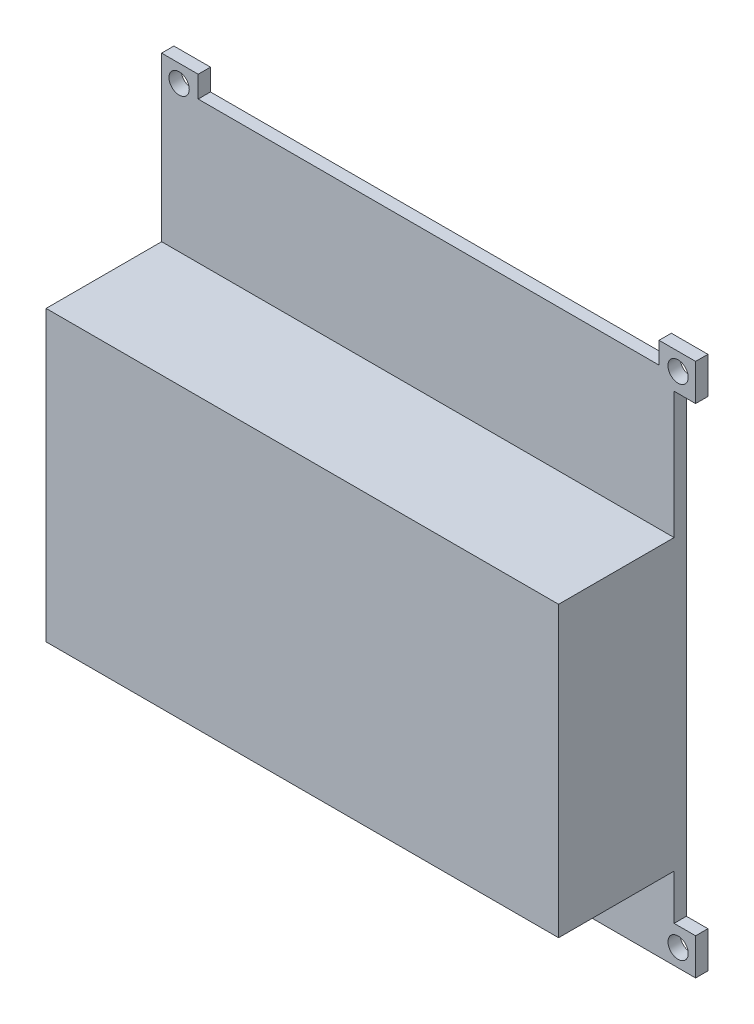
ISO-10303-21;
HEADER;
FILE_DESCRIPTION(('STEP AP214'),'2;1');
FILE_NAME('part.step','',(''),(''),'','','');
FILE_SCHEMA(('AUTOMOTIVE_DESIGN { 1 0 10303 214 1 1 1 1 }'));
ENDSEC;
DATA;
#1=APPLICATION_CONTEXT('core data for automotive mechanical design processes');
#2=APPLICATION_PROTOCOL_DEFINITION('international standard','automotive_design',2000,#1);
#3=PRODUCT_CONTEXT('',#1,'mechanical');
#4=PRODUCT('Part','Part','',(#3));
#5=PRODUCT_RELATED_PRODUCT_CATEGORY('part','',(#4));
#6=PRODUCT_DEFINITION_FORMATION('','',#4);
#7=PRODUCT_DEFINITION_CONTEXT('part definition',#1,'design');
#8=PRODUCT_DEFINITION('design','',#6,#7);
#9=PRODUCT_DEFINITION_SHAPE('','',#8);
#10=(LENGTH_UNIT() NAMED_UNIT(*) SI_UNIT(.MILLI.,.METRE.));
#11=(NAMED_UNIT(*) PLANE_ANGLE_UNIT() SI_UNIT($,.RADIAN.));
#12=(NAMED_UNIT(*) SI_UNIT($,.STERADIAN.) SOLID_ANGLE_UNIT());
#13=UNCERTAINTY_MEASURE_WITH_UNIT(LENGTH_MEASURE(1.E-05),#10,'distance_accuracy_value','');
#14=(GEOMETRIC_REPRESENTATION_CONTEXT(3) GLOBAL_UNCERTAINTY_ASSIGNED_CONTEXT((#13)) GLOBAL_UNIT_ASSIGNED_CONTEXT((#10,
#11,#12)) REPRESENTATION_CONTEXT('',''));
#15=CARTESIAN_POINT('',(0.,0.,0.));
#16=DIRECTION('',(0.,0.,1.));
#17=DIRECTION('',(1.,0.,0.));
#18=AXIS2_PLACEMENT_3D('',#15,#16,#17);
#19=CARTESIAN_POINT('',(0.,86.9,2.));
#20=DIRECTION('',(0.,-1.,0.));
#21=DIRECTION('',(0.,0.,-1.));
#22=AXIS2_PLACEMENT_3D('',#19,#20,#21);
#23=PLANE('',#22);
#24=DIRECTION('',(0.,0.,1.));
#25=VECTOR('',#24,1.);
#26=CARTESIAN_POINT('',(-80.95,86.9,0.));
#27=LINE('',#26,#25);
#28=CARTESIAN_POINT('',(-80.95,86.9,0.));
#29=VERTEX_POINT('',#28);
#30=CARTESIAN_POINT('',(-80.95,86.9,2.));
#31=VERTEX_POINT('',#30);
#32=EDGE_CURVE('E270',#29,#31,#27,.T.);
#33=ORIENTED_EDGE('',*,*,#32,.F.);
#34=DIRECTION('',(-1.,0.,0.));
#35=VECTOR('',#34,1.);
#36=CARTESIAN_POINT('',(0.,86.9,0.));
#37=LINE('',#36,#35);
#38=CARTESIAN_POINT('',(-86.9,86.9,0.));
#39=VERTEX_POINT('',#38);
#40=EDGE_CURVE('E216',#29,#39,#37,.T.);
#41=ORIENTED_EDGE('',*,*,#40,.T.);
#42=DIRECTION('',(0.,0.,-1.));
#43=VECTOR('',#42,1.);
#44=CARTESIAN_POINT('',(-86.9,86.9,2.));
#45=LINE('',#44,#43);
#46=CARTESIAN_POINT('',(-86.9,86.9,2.));
#47=VERTEX_POINT('',#46);
#48=EDGE_CURVE('E226',#47,#39,#45,.T.);
#49=ORIENTED_EDGE('',*,*,#48,.F.);
#50=DIRECTION('',(-1.,0.,0.));
#51=VECTOR('',#50,1.);
#52=CARTESIAN_POINT('',(0.,86.9,2.));
#53=LINE('',#52,#51);
#54=EDGE_CURVE('E408',#31,#47,#53,.T.);
#55=ORIENTED_EDGE('',*,*,#54,.F.);
#56=EDGE_LOOP('',(#33,#41,#49,#55));
#57=FACE_BOUND('',#56,.T.);
#58=ADVANCED_FACE('F44',(#57),#23,.F.);
#59=CARTESIAN_POINT('',(0.,0.,20.8));
#60=DIRECTION('',(0.,0.,-1.));
#61=DIRECTION('',(-1.,0.,0.));
#62=AXIS2_PLACEMENT_3D('',#59,#60,#61);
#63=PLANE('',#62);
#64=DIRECTION('',(0.,-1.,0.));
#65=VECTOR('',#64,1.);
#66=CARTESIAN_POINT('',(-3.5,80.95,20.8));
#67=LINE('',#66,#65);
#68=CARTESIAN_POINT('',(-3.5,60.32,20.8));
#69=VERTEX_POINT('',#68);
#70=CARTESIAN_POINT('',(-3.5,13.32,20.8));
#71=VERTEX_POINT('',#70);
#72=EDGE_CURVE('E68',#69,#71,#67,.T.);
#73=ORIENTED_EDGE('',*,*,#72,.F.);
#74=DIRECTION('',(1.,0.,0.));
#75=VECTOR('',#74,1.);
#76=CARTESIAN_POINT('',(-86.9,60.32,20.8));
#77=LINE('',#76,#75);
#78=CARTESIAN_POINT('',(-86.9,60.32,20.8));
#79=VERTEX_POINT('',#78);
#80=EDGE_CURVE('E338',#79,#69,#77,.T.);
#81=ORIENTED_EDGE('',*,*,#80,.F.);
#82=DIRECTION('',(0.,-1.,0.));
#83=VECTOR('',#82,1.);
#84=CARTESIAN_POINT('',(-86.9,60.32,20.8));
#85=LINE('',#84,#83);
#86=CARTESIAN_POINT('',(-86.9,13.32,20.8));
#87=VERTEX_POINT('',#86);
#88=EDGE_CURVE('E348',#79,#87,#85,.T.);
#89=ORIENTED_EDGE('',*,*,#88,.T.);
#90=DIRECTION('',(1.,0.,0.));
#91=VECTOR('',#90,1.);
#92=CARTESIAN_POINT('',(-86.9,13.32,20.8));
#93=LINE('',#92,#91);
#94=EDGE_CURVE('E345',#87,#71,#93,.T.);
#95=ORIENTED_EDGE('',*,*,#94,.T.);
#96=EDGE_LOOP('',(#73,#81,#89,#95));
#97=FACE_BOUND('',#96,.T.);
#98=ADVANCED_FACE('F457',(#97),#63,.F.);
#99=CARTESIAN_POINT('',(0.,0.,2.));
#100=DIRECTION('',(-1.,0.,0.));
#101=DIRECTION('',(0.,0.,1.));
#102=AXIS2_PLACEMENT_3D('',#99,#100,#101);
#103=PLANE('',#102);
#104=DIRECTION('',(0.,0.,1.));
#105=VECTOR('',#104,1.);
#106=CARTESIAN_POINT('',(0.,80.95,0.));
#107=LINE('',#106,#105);
#108=CARTESIAN_POINT('',(0.,80.95,0.));
#109=VERTEX_POINT('',#108);
#110=CARTESIAN_POINT('',(0.,80.95,2.));
#111=VERTEX_POINT('',#110);
#112=EDGE_CURVE('E187',#109,#111,#107,.T.);
#113=ORIENTED_EDGE('',*,*,#112,.F.);
#114=DIRECTION('',(0.,1.,0.));
#115=VECTOR('',#114,1.);
#116=CARTESIAN_POINT('',(0.,0.,0.));
#117=LINE('',#116,#115);
#118=CARTESIAN_POINT('',(0.,86.9,0.));
#119=VERTEX_POINT('',#118);
#120=EDGE_CURVE('E197',#109,#119,#117,.T.);
#121=ORIENTED_EDGE('',*,*,#120,.T.);
#122=DIRECTION('',(0.,0.,-1.));
#123=VECTOR('',#122,1.);
#124=CARTESIAN_POINT('',(0.,86.9,2.));
#125=LINE('',#124,#123);
#126=CARTESIAN_POINT('',(0.,86.9,2.));
#127=VERTEX_POINT('',#126);
#128=EDGE_CURVE('E224',#127,#119,#125,.T.);
#129=ORIENTED_EDGE('',*,*,#128,.F.);
#130=DIRECTION('',(0.,1.,0.));
#131=VECTOR('',#130,1.);
#132=CARTESIAN_POINT('',(0.,0.,2.));
#133=LINE('',#132,#131);
#134=EDGE_CURVE('E205',#111,#127,#133,.T.);
#135=ORIENTED_EDGE('',*,*,#134,.F.);
#136=EDGE_LOOP('',(#113,#121,#129,#135));
#137=FACE_BOUND('',#136,.T.);
#138=ADVANCED_FACE('F200',(#137),#103,.F.);
#139=CARTESIAN_POINT('',(0.,0.,0.));
#140=DIRECTION('',(0.,0.,-1.));
#141=DIRECTION('',(-1.,0.,0.));
#142=AXIS2_PLACEMENT_3D('',#139,#140,#141);
#143=PLANE('',#142);
#144=CARTESIAN_POINT('',(-84.05,84.05,0.));
#145=DIRECTION('',(0.,0.,1.));
#146=DIRECTION('',(1.,0.,0.));
#147=AXIS2_PLACEMENT_3D('',#144,#145,#146);
#148=CIRCLE('',#147,1.65);
#149=CARTESIAN_POINT('',(-82.4,84.05,0.));
#150=VERTEX_POINT('',#149);
#151=EDGE_CURVE('E365',#150,#150,#148,.T.);
#152=ORIENTED_EDGE('',*,*,#151,.T.);
#153=EDGE_LOOP('',(#152));
#154=FACE_BOUND('',#153,.T.);
#155=CARTESIAN_POINT('',(-2.84999999999997,84.05,0.));
#156=DIRECTION('',(0.,0.,1.));
#157=DIRECTION('',(1.,0.,0.));
#158=AXIS2_PLACEMENT_3D('',#155,#156,#157);
#159=CIRCLE('',#158,1.65);
#160=CARTESIAN_POINT('',(-1.19999999999997,84.05,0.));
#161=VERTEX_POINT('',#160);
#162=EDGE_CURVE('E378',#161,#161,#159,.T.);
#163=ORIENTED_EDGE('',*,*,#162,.T.);
#164=EDGE_LOOP('',(#163));
#165=FACE_BOUND('',#164,.T.);
#166=CARTESIAN_POINT('',(-2.85,2.84999999999999,0.));
#167=DIRECTION('',(0.,0.,1.));
#168=DIRECTION('',(1.,0.,0.));
#169=AXIS2_PLACEMENT_3D('',#166,#167,#168);
#170=CIRCLE('',#169,1.65);
#171=CARTESIAN_POINT('',(-1.2,2.84999999999999,0.));
#172=VERTEX_POINT('',#171);
#173=EDGE_CURVE('E371',#172,#172,#170,.T.);
#174=ORIENTED_EDGE('',*,*,#173,.T.);
#175=EDGE_LOOP('',(#174));
#176=FACE_BOUND('',#175,.T.);
#177=CARTESIAN_POINT('',(-84.05,2.85000000000001,0.));
#178=DIRECTION('',(0.,0.,1.));
#179=DIRECTION('',(1.,0.,0.));
#180=AXIS2_PLACEMENT_3D('',#177,#178,#179);
#181=CIRCLE('',#180,1.65);
#182=CARTESIAN_POINT('',(-82.4,2.85000000000001,0.));
#183=VERTEX_POINT('',#182);
#184=EDGE_CURVE('E386',#183,#183,#181,.T.);
#185=ORIENTED_EDGE('',*,*,#184,.T.);
#186=EDGE_LOOP('',(#185));
#187=FACE_BOUND('',#186,.T.);
#188=DIRECTION('',(0.,-1.,0.));
#189=VECTOR('',#188,1.);
#190=CARTESIAN_POINT('',(-3.5,80.95,0.));
#191=LINE('',#190,#189);
#192=CARTESIAN_POINT('',(-3.5,80.95,0.));
#193=VERTEX_POINT('',#192);
#194=CARTESIAN_POINT('',(-3.49999999999999,5.95,0.));
#195=VERTEX_POINT('',#194);
#196=EDGE_CURVE('E195',#193,#195,#191,.T.);
#197=ORIENTED_EDGE('',*,*,#196,.T.);
#198=DIRECTION('',(1.,0.,0.));
#199=VECTOR('',#198,1.);
#200=CARTESIAN_POINT('',(0.,5.95,0.));
#201=LINE('',#200,#199);
#202=CARTESIAN_POINT('',(0.,5.95,0.));
#203=VERTEX_POINT('',#202);
#204=EDGE_CURVE('E202',#195,#203,#201,.T.);
#205=ORIENTED_EDGE('',*,*,#204,.T.);
#206=CARTESIAN_POINT('',(0.,0.,0.));
#207=VERTEX_POINT('',#206);
#208=EDGE_CURVE('E213',#207,#203,#117,.T.);
#209=ORIENTED_EDGE('',*,*,#208,.F.);
#210=DIRECTION('',(-1.,0.,0.));
#211=VECTOR('',#210,1.);
#212=CARTESIAN_POINT('',(0.,0.,0.));
#213=LINE('',#212,#211);
#214=CARTESIAN_POINT('',(-86.9,0.,0.));
#215=VERTEX_POINT('',#214);
#216=EDGE_CURVE('E393',#207,#215,#213,.T.);
#217=ORIENTED_EDGE('',*,*,#216,.T.);
#218=DIRECTION('',(0.,1.,0.));
#219=VECTOR('',#218,1.);
#220=CARTESIAN_POINT('',(-86.9,0.,0.));
#221=LINE('',#220,#219);
#222=EDGE_CURVE('E413',#215,#39,#221,.T.);
#223=ORIENTED_EDGE('',*,*,#222,.T.);
#224=ORIENTED_EDGE('',*,*,#40,.F.);
#225=DIRECTION('',(0.,-1.,0.));
#226=VECTOR('',#225,1.);
#227=CARTESIAN_POINT('',(-80.95,86.9,0.));
#228=LINE('',#227,#226);
#229=CARTESIAN_POINT('',(-80.95,83.4,0.));
#230=VERTEX_POINT('',#229);
#231=EDGE_CURVE('E272',#29,#230,#228,.T.);
#232=ORIENTED_EDGE('',*,*,#231,.T.);
#233=DIRECTION('',(1.,0.,0.));
#234=VECTOR('',#233,1.);
#235=CARTESIAN_POINT('',(-5.95,83.4,0.));
#236=LINE('',#235,#234);
#237=CARTESIAN_POINT('',(-5.95,83.4,0.));
#238=VERTEX_POINT('',#237);
#239=EDGE_CURVE('E268',#230,#238,#236,.T.);
#240=ORIENTED_EDGE('',*,*,#239,.T.);
#241=DIRECTION('',(0.,1.,0.));
#242=VECTOR('',#241,1.);
#243=CARTESIAN_POINT('',(-5.95,86.9,0.));
#244=LINE('',#243,#242);
#245=CARTESIAN_POINT('',(-5.95,86.9,0.));
#246=VERTEX_POINT('',#245);
#247=EDGE_CURVE('E63',#238,#246,#244,.T.);
#248=ORIENTED_EDGE('',*,*,#247,.T.);
#249=EDGE_CURVE('E209',#119,#246,#37,.T.);
#250=ORIENTED_EDGE('',*,*,#249,.F.);
#251=ORIENTED_EDGE('',*,*,#120,.F.);
#252=DIRECTION('',(-1.,0.,0.));
#253=VECTOR('',#252,1.);
#254=CARTESIAN_POINT('',(0.,80.95,0.));
#255=LINE('',#254,#253);
#256=EDGE_CURVE('E182',#109,#193,#255,.T.);
#257=ORIENTED_EDGE('',*,*,#256,.T.);
#258=EDGE_LOOP('',(#197,#205,#209,#217,#223,#224,#232,#240,#248,#250,#251,#257));
#259=FACE_BOUND('',#258,.T.);
#260=ADVANCED_FACE('F210',(#154,#165,#176,#187,#259),#143,.T.);
#261=CARTESIAN_POINT('',(0.,0.,2.));
#262=DIRECTION('',(0.,0.,-1.));
#263=DIRECTION('',(-1.,0.,0.));
#264=AXIS2_PLACEMENT_3D('',#261,#262,#263);
#265=PLANE('',#264);
#266=CARTESIAN_POINT('',(-84.05,2.85000000000001,2.));
#267=DIRECTION('',(0.,0.,1.));
#268=DIRECTION('',(1.,0.,0.));
#269=AXIS2_PLACEMENT_3D('',#266,#267,#268);
#270=CIRCLE('',#269,1.65);
#271=CARTESIAN_POINT('',(-82.4,2.85000000000001,2.));
#272=VERTEX_POINT('',#271);
#273=EDGE_CURVE('E369',#272,#272,#270,.T.);
#274=ORIENTED_EDGE('',*,*,#273,.F.);
#275=EDGE_LOOP('',(#274));
#276=FACE_BOUND('',#275,.T.);
#277=CARTESIAN_POINT('',(-2.85,2.84999999999999,2.));
#278=DIRECTION('',(0.,0.,1.));
#279=DIRECTION('',(1.,0.,0.));
#280=AXIS2_PLACEMENT_3D('',#277,#278,#279);
#281=CIRCLE('',#280,1.65);
#282=CARTESIAN_POINT('',(-1.2,2.84999999999999,2.));
#283=VERTEX_POINT('',#282);
#284=EDGE_CURVE('E366',#283,#283,#281,.T.);
#285=ORIENTED_EDGE('',*,*,#284,.F.);
#286=EDGE_LOOP('',(#285));
#287=FACE_BOUND('',#286,.T.);
#288=CARTESIAN_POINT('',(0.,0.,2.));
#289=VERTEX_POINT('',#288);
#290=CARTESIAN_POINT('',(0.,5.95,2.));
#291=VERTEX_POINT('',#290);
#292=EDGE_CURVE('E232',#289,#291,#133,.T.);
#293=ORIENTED_EDGE('',*,*,#292,.T.);
#294=DIRECTION('',(-1.,0.,0.));
#295=VECTOR('',#294,1.);
#296=CARTESIAN_POINT('',(0.,5.95,2.));
#297=LINE('',#296,#295);
#298=CARTESIAN_POINT('',(-3.49999999999999,5.95,2.));
#299=VERTEX_POINT('',#298);
#300=EDGE_CURVE('E287',#291,#299,#297,.T.);
#301=ORIENTED_EDGE('',*,*,#300,.T.);
#302=DIRECTION('',(0.,1.,0.));
#303=VECTOR('',#302,1.);
#304=CARTESIAN_POINT('',(-3.49999999999999,0.,2.));
#305=LINE('',#304,#303);
#306=CARTESIAN_POINT('',(-3.5,13.32,2.));
#307=VERTEX_POINT('',#306);
#308=EDGE_CURVE('E273',#299,#307,#305,.T.);
#309=ORIENTED_EDGE('',*,*,#308,.T.);
#310=DIRECTION('',(1.,0.,0.));
#311=VECTOR('',#310,1.);
#312=CARTESIAN_POINT('',(-86.9,13.32,2.));
#313=LINE('',#312,#311);
#314=CARTESIAN_POINT('',(-86.9,13.32,2.));
#315=VERTEX_POINT('',#314);
#316=EDGE_CURVE('E341',#315,#307,#313,.T.);
#317=ORIENTED_EDGE('',*,*,#316,.F.);
#318=DIRECTION('',(0.,1.,0.));
#319=VECTOR('',#318,1.);
#320=CARTESIAN_POINT('',(-86.9,0.,2.));
#321=LINE('',#320,#319);
#322=CARTESIAN_POINT('',(-86.9,0.,2.));
#323=VERTEX_POINT('',#322);
#324=EDGE_CURVE('E405',#323,#315,#321,.T.);
#325=ORIENTED_EDGE('',*,*,#324,.F.);
#326=DIRECTION('',(-1.,0.,0.));
#327=VECTOR('',#326,1.);
#328=CARTESIAN_POINT('',(0.,0.,2.));
#329=LINE('',#328,#327);
#330=EDGE_CURVE('E219',#289,#323,#329,.T.);
#331=ORIENTED_EDGE('',*,*,#330,.F.);
#332=EDGE_LOOP('',(#293,#301,#309,#317,#325,#331));
#333=FACE_BOUND('',#332,.T.);
#334=ADVANCED_FACE('F485',(#276,#287,#333),#265,.F.);
#335=CARTESIAN_POINT('',(0.,0.,2.));
#336=DIRECTION('',(0.,-1.,0.));
#337=DIRECTION('',(0.,0.,-1.));
#338=AXIS2_PLACEMENT_3D('',#335,#336,#337);
#339=PLANE('',#338);
#340=ORIENTED_EDGE('',*,*,#216,.F.);
#341=DIRECTION('',(0.,0.,-1.));
#342=VECTOR('',#341,1.);
#343=CARTESIAN_POINT('',(0.,0.,2.));
#344=LINE('',#343,#342);
#345=EDGE_CURVE('E223',#289,#207,#344,.T.);
#346=ORIENTED_EDGE('',*,*,#345,.F.);
#347=ORIENTED_EDGE('',*,*,#330,.T.);
#348=DIRECTION('',(0.,0.,-1.));
#349=VECTOR('',#348,1.);
#350=CARTESIAN_POINT('',(-86.9,0.,2.));
#351=LINE('',#350,#349);
#352=EDGE_CURVE('E235',#323,#215,#351,.T.);
#353=ORIENTED_EDGE('',*,*,#352,.T.);
#354=EDGE_LOOP('',(#340,#346,#347,#353));
#355=FACE_BOUND('',#354,.T.);
#356=ADVANCED_FACE('F50',(#355),#339,.T.);
#357=ORIENTED_EDGE('',*,*,#208,.T.);
#358=DIRECTION('',(0.,0.,1.));
#359=VECTOR('',#358,1.);
#360=CARTESIAN_POINT('',(0.,5.95,0.));
#361=LINE('',#360,#359);
#362=EDGE_CURVE('E276',#203,#291,#361,.T.);
#363=ORIENTED_EDGE('',*,*,#362,.T.);
#364=ORIENTED_EDGE('',*,*,#292,.F.);
#365=ORIENTED_EDGE('',*,*,#345,.T.);
#366=EDGE_LOOP('',(#357,#363,#364,#365));
#367=FACE_BOUND('',#366,.T.);
#368=ADVANCED_FACE('F468',(#367),#103,.F.);
#369=ORIENTED_EDGE('',*,*,#249,.T.);
#370=DIRECTION('',(0.,0.,1.));
#371=VECTOR('',#370,1.);
#372=CARTESIAN_POINT('',(-5.95,86.9,0.));
#373=LINE('',#372,#371);
#374=CARTESIAN_POINT('',(-5.95,86.9,2.));
#375=VERTEX_POINT('',#374);
#376=EDGE_CURVE('E254',#246,#375,#373,.T.);
#377=ORIENTED_EDGE('',*,*,#376,.T.);
#378=EDGE_CURVE('E249',#127,#375,#53,.T.);
#379=ORIENTED_EDGE('',*,*,#378,.F.);
#380=ORIENTED_EDGE('',*,*,#128,.T.);
#381=EDGE_LOOP('',(#369,#377,#379,#380));
#382=FACE_BOUND('',#381,.T.);
#383=ADVANCED_FACE('F258',(#382),#23,.F.);
#384=CARTESIAN_POINT('',(-86.9,0.,2.));
#385=DIRECTION('',(-1.,0.,0.));
#386=DIRECTION('',(0.,0.,1.));
#387=AXIS2_PLACEMENT_3D('',#384,#385,#386);
#388=PLANE('',#387);
#389=DIRECTION('',(0.,0.,-1.));
#390=VECTOR('',#389,1.);
#391=CARTESIAN_POINT('',(-86.9,58.32,18.8));
#392=LINE('',#391,#390);
#393=CARTESIAN_POINT('',(-86.9,58.32,18.8));
#394=VERTEX_POINT('',#393);
#395=CARTESIAN_POINT('',(-86.9,58.32,2.));
#396=VERTEX_POINT('',#395);
#397=EDGE_CURVE('E306',#394,#396,#392,.T.);
#398=ORIENTED_EDGE('',*,*,#397,.F.);
#399=DIRECTION('',(0.,-1.,0.));
#400=VECTOR('',#399,1.);
#401=CARTESIAN_POINT('',(-86.9,58.32,18.8));
#402=LINE('',#401,#400);
#403=CARTESIAN_POINT('',(-86.9,15.32,18.8));
#404=VERTEX_POINT('',#403);
#405=EDGE_CURVE('E309',#394,#404,#402,.T.);
#406=ORIENTED_EDGE('',*,*,#405,.T.);
#407=DIRECTION('',(0.,0.,-1.));
#408=VECTOR('',#407,1.);
#409=CARTESIAN_POINT('',(-86.9,15.32,18.8));
#410=LINE('',#409,#408);
#411=CARTESIAN_POINT('',(-86.9,15.32,2.));
#412=VERTEX_POINT('',#411);
#413=EDGE_CURVE('E299',#404,#412,#410,.T.);
#414=ORIENTED_EDGE('',*,*,#413,.T.);
#415=DIRECTION('',(0.,-1.,0.));
#416=VECTOR('',#415,1.);
#417=CARTESIAN_POINT('',(-86.9,58.32,2.));
#418=LINE('',#417,#416);
#419=EDGE_CURVE('E330',#396,#412,#418,.T.);
#420=ORIENTED_EDGE('',*,*,#419,.F.);
#421=EDGE_LOOP('',(#398,#406,#414,#420));
#422=FACE_BOUND('',#421,.T.);
#423=ORIENTED_EDGE('',*,*,#222,.F.);
#424=ORIENTED_EDGE('',*,*,#352,.F.);
#425=ORIENTED_EDGE('',*,*,#324,.T.);
#426=DIRECTION('',(0.,0.,-1.));
#427=VECTOR('',#426,1.);
#428=CARTESIAN_POINT('',(-86.9,13.32,20.8));
#429=LINE('',#428,#427);
#430=EDGE_CURVE('E355',#87,#315,#429,.T.);
#431=ORIENTED_EDGE('',*,*,#430,.F.);
#432=ORIENTED_EDGE('',*,*,#88,.F.);
#433=DIRECTION('',(0.,0.,-1.));
#434=VECTOR('',#433,1.);
#435=CARTESIAN_POINT('',(-86.9,60.32,20.8));
#436=LINE('',#435,#434);
#437=CARTESIAN_POINT('',(-86.9,60.32,2.));
#438=VERTEX_POINT('',#437);
#439=EDGE_CURVE('E356',#79,#438,#436,.T.);
#440=ORIENTED_EDGE('',*,*,#439,.T.);
#441=EDGE_CURVE('E402',#438,#47,#321,.T.);
#442=ORIENTED_EDGE('',*,*,#441,.T.);
#443=ORIENTED_EDGE('',*,*,#48,.T.);
#444=EDGE_LOOP('',(#423,#424,#425,#431,#432,#440,#442,#443));
#445=FACE_BOUND('',#444,.T.);
#446=ADVANCED_FACE('F428',(#422,#445),#388,.T.);
#447=CARTESIAN_POINT('',(-84.05,84.05,2.));
#448=DIRECTION('',(0.,0.,1.));
#449=DIRECTION('',(1.,0.,0.));
#450=AXIS2_PLACEMENT_3D('',#447,#448,#449);
#451=CIRCLE('',#450,1.65);
#452=CARTESIAN_POINT('',(-82.4,84.05,2.));
#453=VERTEX_POINT('',#452);
#454=EDGE_CURVE('E384',#453,#453,#451,.T.);
#455=ORIENTED_EDGE('',*,*,#454,.F.);
#456=EDGE_LOOP('',(#455));
#457=FACE_BOUND('',#456,.T.);
#458=CARTESIAN_POINT('',(-2.84999999999997,84.05,2.));
#459=DIRECTION('',(0.,0.,1.));
#460=DIRECTION('',(1.,0.,0.));
#461=AXIS2_PLACEMENT_3D('',#458,#459,#460);
#462=CIRCLE('',#461,1.65);
#463=CARTESIAN_POINT('',(-1.19999999999997,84.05,2.));
#464=VERTEX_POINT('',#463);
#465=EDGE_CURVE('E374',#464,#464,#462,.T.);
#466=ORIENTED_EDGE('',*,*,#465,.F.);
#467=EDGE_LOOP('',(#466));
#468=FACE_BOUND('',#467,.T.);
#469=DIRECTION('',(1.,0.,0.));
#470=VECTOR('',#469,1.);
#471=CARTESIAN_POINT('',(-86.9,60.32,2.));
#472=LINE('',#471,#470);
#473=CARTESIAN_POINT('',(-3.5,60.32,2.));
#474=VERTEX_POINT('',#473);
#475=EDGE_CURVE('E339',#438,#474,#472,.T.);
#476=ORIENTED_EDGE('',*,*,#475,.T.);
#477=DIRECTION('',(0.,1.,0.));
#478=VECTOR('',#477,1.);
#479=CARTESIAN_POINT('',(-3.49999999999999,0.,2.));
#480=LINE('',#479,#478);
#481=CARTESIAN_POINT('',(-3.5,80.95,2.));
#482=VERTEX_POINT('',#481);
#483=EDGE_CURVE('E285',#474,#482,#480,.T.);
#484=ORIENTED_EDGE('',*,*,#483,.T.);
#485=DIRECTION('',(1.,0.,0.));
#486=VECTOR('',#485,1.);
#487=CARTESIAN_POINT('',(0.,80.95,2.));
#488=LINE('',#487,#486);
#489=EDGE_CURVE('E11',#482,#111,#488,.T.);
#490=ORIENTED_EDGE('',*,*,#489,.T.);
#491=ORIENTED_EDGE('',*,*,#134,.T.);
#492=ORIENTED_EDGE('',*,*,#378,.T.);
#493=DIRECTION('',(0.,-1.,0.));
#494=VECTOR('',#493,1.);
#495=CARTESIAN_POINT('',(-5.95000000000006,0.,2.));
#496=LINE('',#495,#494);
#497=CARTESIAN_POINT('',(-5.95,83.4,2.));
#498=VERTEX_POINT('',#497);
#499=EDGE_CURVE('E53',#375,#498,#496,.T.);
#500=ORIENTED_EDGE('',*,*,#499,.T.);
#501=DIRECTION('',(-1.,0.,0.));
#502=VECTOR('',#501,1.);
#503=CARTESIAN_POINT('',(0.,83.4,2.));
#504=LINE('',#503,#502);
#505=CARTESIAN_POINT('',(-80.95,83.4,2.));
#506=VERTEX_POINT('',#505);
#507=EDGE_CURVE('E247',#498,#506,#504,.T.);
#508=ORIENTED_EDGE('',*,*,#507,.T.);
#509=DIRECTION('',(0.,1.,0.));
#510=VECTOR('',#509,1.);
#511=CARTESIAN_POINT('',(-80.95,0.,2.));
#512=LINE('',#511,#510);
#513=EDGE_CURVE('E238',#506,#31,#512,.T.);
#514=ORIENTED_EDGE('',*,*,#513,.T.);
#515=ORIENTED_EDGE('',*,*,#54,.T.);
#516=ORIENTED_EDGE('',*,*,#441,.F.);
#517=EDGE_LOOP('',(#476,#484,#490,#491,#492,#500,#508,#514,#515,#516));
#518=FACE_BOUND('',#517,.T.);
#519=ADVANCED_FACE('F250',(#457,#468,#518),#265,.F.);
#520=CARTESIAN_POINT('',(-84.05,2.85000000000001,0.));
#521=DIRECTION('',(0.,0.,1.));
#522=DIRECTION('',(1.,0.,0.));
#523=AXIS2_PLACEMENT_3D('',#520,#521,#522);
#524=CYLINDRICAL_SURFACE('',#523,1.65);
#525=ORIENTED_EDGE('',*,*,#184,.F.);
#526=EDGE_LOOP('',(#525));
#527=FACE_BOUND('',#526,.T.);
#528=ORIENTED_EDGE('',*,*,#273,.T.);
#529=EDGE_LOOP('',(#528));
#530=FACE_BOUND('',#529,.T.);
#531=ADVANCED_FACE('F496',(#527,#530),#524,.F.);
#532=CARTESIAN_POINT('',(-2.85,2.84999999999999,0.));
#533=DIRECTION('',(0.,0.,1.));
#534=DIRECTION('',(1.,0.,0.));
#535=AXIS2_PLACEMENT_3D('',#532,#533,#534);
#536=CYLINDRICAL_SURFACE('',#535,1.65);
#537=ORIENTED_EDGE('',*,*,#173,.F.);
#538=EDGE_LOOP('',(#537));
#539=FACE_BOUND('',#538,.T.);
#540=ORIENTED_EDGE('',*,*,#284,.T.);
#541=EDGE_LOOP('',(#540));
#542=FACE_BOUND('',#541,.T.);
#543=ADVANCED_FACE('F499',(#539,#542),#536,.F.);
#544=CARTESIAN_POINT('',(-2.84999999999997,84.05,0.));
#545=DIRECTION('',(0.,0.,1.));
#546=DIRECTION('',(1.,0.,0.));
#547=AXIS2_PLACEMENT_3D('',#544,#545,#546);
#548=CYLINDRICAL_SURFACE('',#547,1.65);
#549=ORIENTED_EDGE('',*,*,#162,.F.);
#550=EDGE_LOOP('',(#549));
#551=FACE_BOUND('',#550,.T.);
#552=ORIENTED_EDGE('',*,*,#465,.T.);
#553=EDGE_LOOP('',(#552));
#554=FACE_BOUND('',#553,.T.);
#555=ADVANCED_FACE('F506',(#551,#554),#548,.F.);
#556=CARTESIAN_POINT('',(-84.05,84.05,0.));
#557=DIRECTION('',(0.,0.,1.));
#558=DIRECTION('',(1.,0.,0.));
#559=AXIS2_PLACEMENT_3D('',#556,#557,#558);
#560=CYLINDRICAL_SURFACE('',#559,1.65);
#561=ORIENTED_EDGE('',*,*,#151,.F.);
#562=EDGE_LOOP('',(#561));
#563=FACE_BOUND('',#562,.T.);
#564=ORIENTED_EDGE('',*,*,#454,.T.);
#565=EDGE_LOOP('',(#564));
#566=FACE_BOUND('',#565,.T.);
#567=ADVANCED_FACE('F505',(#563,#566),#560,.F.);
#568=CARTESIAN_POINT('',(-86.9,60.32,20.8));
#569=DIRECTION('',(0.,1.,0.));
#570=DIRECTION('',(0.,0.,1.));
#571=AXIS2_PLACEMENT_3D('',#568,#569,#570);
#572=PLANE('',#571);
#573=DIRECTION('',(0.,0.,1.));
#574=VECTOR('',#573,1.);
#575=CARTESIAN_POINT('',(-3.5,60.32,20.8));
#576=LINE('',#575,#574);
#577=EDGE_CURVE('E280',#474,#69,#576,.T.);
#578=ORIENTED_EDGE('',*,*,#577,.F.);
#579=ORIENTED_EDGE('',*,*,#475,.F.);
#580=ORIENTED_EDGE('',*,*,#439,.F.);
#581=ORIENTED_EDGE('',*,*,#80,.T.);
#582=EDGE_LOOP('',(#578,#579,#580,#581));
#583=FACE_BOUND('',#582,.T.);
#584=ADVANCED_FACE('F504',(#583),#572,.T.);
#585=CARTESIAN_POINT('',(-86.9,13.32,20.8));
#586=DIRECTION('',(0.,1.,0.));
#587=DIRECTION('',(-1.,0.,0.));
#588=AXIS2_PLACEMENT_3D('',#585,#586,#587);
#589=PLANE('',#588);
#590=ORIENTED_EDGE('',*,*,#316,.T.);
#591=DIRECTION('',(0.,0.,1.));
#592=VECTOR('',#591,1.);
#593=CARTESIAN_POINT('',(-3.5,13.32,20.8));
#594=LINE('',#593,#592);
#595=EDGE_CURVE('E222',#307,#71,#594,.T.);
#596=ORIENTED_EDGE('',*,*,#595,.T.);
#597=ORIENTED_EDGE('',*,*,#94,.F.);
#598=ORIENTED_EDGE('',*,*,#430,.T.);
#599=EDGE_LOOP('',(#590,#596,#597,#598));
#600=FACE_BOUND('',#599,.T.);
#601=ADVANCED_FACE('F518',(#600),#589,.F.);
#602=CARTESIAN_POINT('',(-86.9,58.32,18.8));
#603=DIRECTION('',(0.,0.,-1.));
#604=DIRECTION('',(-1.,0.,0.));
#605=AXIS2_PLACEMENT_3D('',#602,#603,#604);
#606=PLANE('',#605);
#607=DIRECTION('',(1.,0.,0.));
#608=VECTOR('',#607,1.);
#609=CARTESIAN_POINT('',(-86.9,15.32,18.8));
#610=LINE('',#609,#608);
#611=CARTESIAN_POINT('',(-13.12,15.32,18.8));
#612=VERTEX_POINT('',#611);
#613=EDGE_CURVE('E291',#404,#612,#610,.T.);
#614=ORIENTED_EDGE('',*,*,#613,.F.);
#615=ORIENTED_EDGE('',*,*,#405,.F.);
#616=DIRECTION('',(1.,0.,0.));
#617=VECTOR('',#616,1.);
#618=CARTESIAN_POINT('',(-86.9,58.32,18.8));
#619=LINE('',#618,#617);
#620=CARTESIAN_POINT('',(-13.12,58.32,18.8));
#621=VERTEX_POINT('',#620);
#622=EDGE_CURVE('E295',#394,#621,#619,.T.);
#623=ORIENTED_EDGE('',*,*,#622,.T.);
#624=DIRECTION('',(0.,-1.,0.));
#625=VECTOR('',#624,1.);
#626=CARTESIAN_POINT('',(-13.12,58.32,18.8));
#627=LINE('',#626,#625);
#628=EDGE_CURVE('E334',#621,#612,#627,.T.);
#629=ORIENTED_EDGE('',*,*,#628,.T.);
#630=EDGE_LOOP('',(#614,#615,#623,#629));
#631=FACE_BOUND('',#630,.T.);
#632=ADVANCED_FACE('F520',(#631),#606,.T.);
#633=CARTESIAN_POINT('',(-13.12,58.32,18.8));
#634=DIRECTION('',(-1.,0.,0.));
#635=DIRECTION('',(0.,0.,1.));
#636=AXIS2_PLACEMENT_3D('',#633,#634,#635);
#637=PLANE('',#636);
#638=DIRECTION('',(0.,0.,-1.));
#639=VECTOR('',#638,1.);
#640=CARTESIAN_POINT('',(-13.12,15.32,18.8));
#641=LINE('',#640,#639);
#642=CARTESIAN_POINT('',(-13.12,15.32,2.));
#643=VERTEX_POINT('',#642);
#644=EDGE_CURVE('E313',#612,#643,#641,.T.);
#645=ORIENTED_EDGE('',*,*,#644,.F.);
#646=ORIENTED_EDGE('',*,*,#628,.F.);
#647=DIRECTION('',(0.,0.,-1.));
#648=VECTOR('',#647,1.);
#649=CARTESIAN_POINT('',(-13.12,58.32,18.8));
#650=LINE('',#649,#648);
#651=CARTESIAN_POINT('',(-13.12,58.32,2.));
#652=VERTEX_POINT('',#651);
#653=EDGE_CURVE('E296',#621,#652,#650,.T.);
#654=ORIENTED_EDGE('',*,*,#653,.T.);
#655=DIRECTION('',(0.,-1.,0.));
#656=VECTOR('',#655,1.);
#657=CARTESIAN_POINT('',(-13.12,58.32,2.));
#658=LINE('',#657,#656);
#659=EDGE_CURVE('E335',#652,#643,#658,.T.);
#660=ORIENTED_EDGE('',*,*,#659,.T.);
#661=EDGE_LOOP('',(#645,#646,#654,#660));
#662=FACE_BOUND('',#661,.T.);
#663=ADVANCED_FACE('F523',(#662),#637,.T.);
#664=CARTESIAN_POINT('',(-86.9,58.32,2.));
#665=DIRECTION('',(0.,0.,-1.));
#666=DIRECTION('',(-1.,0.,0.));
#667=AXIS2_PLACEMENT_3D('',#664,#665,#666);
#668=PLANE('',#667);
#669=DIRECTION('',(1.,0.,0.));
#670=VECTOR('',#669,1.);
#671=CARTESIAN_POINT('',(-86.9,15.32,2.));
#672=LINE('',#671,#670);
#673=EDGE_CURVE('E319',#412,#643,#672,.T.);
#674=ORIENTED_EDGE('',*,*,#673,.T.);
#675=ORIENTED_EDGE('',*,*,#659,.F.);
#676=DIRECTION('',(1.,0.,0.));
#677=VECTOR('',#676,1.);
#678=CARTESIAN_POINT('',(-86.9,58.32,2.));
#679=LINE('',#678,#677);
#680=EDGE_CURVE('E305',#396,#652,#679,.T.);
#681=ORIENTED_EDGE('',*,*,#680,.F.);
#682=ORIENTED_EDGE('',*,*,#419,.T.);
#683=EDGE_LOOP('',(#674,#675,#681,#682));
#684=FACE_BOUND('',#683,.T.);
#685=ADVANCED_FACE('F526',(#684),#668,.F.);
#686=CARTESIAN_POINT('',(0.,58.32,0.));
#687=DIRECTION('',(0.,1.,0.));
#688=DIRECTION('',(-1.,0.,0.));
#689=AXIS2_PLACEMENT_3D('',#686,#687,#688);
#690=PLANE('',#689);
#691=ORIENTED_EDGE('',*,*,#622,.F.);
#692=ORIENTED_EDGE('',*,*,#397,.T.);
#693=ORIENTED_EDGE('',*,*,#680,.T.);
#694=ORIENTED_EDGE('',*,*,#653,.F.);
#695=EDGE_LOOP('',(#691,#692,#693,#694));
#696=FACE_BOUND('',#695,.T.);
#697=ADVANCED_FACE('F535',(#696),#690,.F.);
#698=CARTESIAN_POINT('',(0.,15.32,0.));
#699=DIRECTION('',(0.,1.,0.));
#700=DIRECTION('',(-1.,0.,0.));
#701=AXIS2_PLACEMENT_3D('',#698,#699,#700);
#702=PLANE('',#701);
#703=ORIENTED_EDGE('',*,*,#613,.T.);
#704=ORIENTED_EDGE('',*,*,#644,.T.);
#705=ORIENTED_EDGE('',*,*,#673,.F.);
#706=ORIENTED_EDGE('',*,*,#413,.F.);
#707=EDGE_LOOP('',(#703,#704,#705,#706));
#708=FACE_BOUND('',#707,.T.);
#709=ADVANCED_FACE('F534',(#708),#702,.T.);
#710=CARTESIAN_POINT('',(0.,5.95,0.));
#711=DIRECTION('',(0.,-1.,0.));
#712=DIRECTION('',(0.,0.,-1.));
#713=AXIS2_PLACEMENT_3D('',#710,#711,#712);
#714=PLANE('',#713);
#715=ORIENTED_EDGE('',*,*,#362,.F.);
#716=ORIENTED_EDGE('',*,*,#204,.F.);
#717=DIRECTION('',(0.,0.,1.));
#718=VECTOR('',#717,1.);
#719=CARTESIAN_POINT('',(-3.49999999999999,5.95,0.));
#720=LINE('',#719,#718);
#721=EDGE_CURVE('E434',#195,#299,#720,.T.);
#722=ORIENTED_EDGE('',*,*,#721,.T.);
#723=ORIENTED_EDGE('',*,*,#300,.F.);
#724=EDGE_LOOP('',(#715,#716,#722,#723));
#725=FACE_BOUND('',#724,.T.);
#726=ADVANCED_FACE('F538',(#725),#714,.F.);
#727=CARTESIAN_POINT('',(0.,80.95,0.));
#728=DIRECTION('',(0.,1.,0.));
#729=DIRECTION('',(0.,0.,1.));
#730=AXIS2_PLACEMENT_3D('',#727,#728,#729);
#731=PLANE('',#730);
#732=DIRECTION('',(0.,0.,1.));
#733=VECTOR('',#732,1.);
#734=CARTESIAN_POINT('',(-3.5,80.95,0.));
#735=LINE('',#734,#733);
#736=EDGE_CURVE('E189',#193,#482,#735,.T.);
#737=ORIENTED_EDGE('',*,*,#736,.F.);
#738=ORIENTED_EDGE('',*,*,#256,.F.);
#739=ORIENTED_EDGE('',*,*,#112,.T.);
#740=ORIENTED_EDGE('',*,*,#489,.F.);
#741=EDGE_LOOP('',(#737,#738,#739,#740));
#742=FACE_BOUND('',#741,.T.);
#743=ADVANCED_FACE('F184',(#742),#731,.F.);
#744=CARTESIAN_POINT('',(-3.5,80.95,0.));
#745=DIRECTION('',(-1.,0.,0.));
#746=DIRECTION('',(0.,-1.,0.));
#747=AXIS2_PLACEMENT_3D('',#744,#745,#746);
#748=PLANE('',#747);
#749=ORIENTED_EDGE('',*,*,#577,.T.);
#750=ORIENTED_EDGE('',*,*,#72,.T.);
#751=ORIENTED_EDGE('',*,*,#595,.F.);
#752=ORIENTED_EDGE('',*,*,#308,.F.);
#753=ORIENTED_EDGE('',*,*,#721,.F.);
#754=ORIENTED_EDGE('',*,*,#196,.F.);
#755=ORIENTED_EDGE('',*,*,#736,.T.);
#756=ORIENTED_EDGE('',*,*,#483,.F.);
#757=EDGE_LOOP('',(#749,#750,#751,#752,#753,#754,#755,#756));
#758=FACE_BOUND('',#757,.T.);
#759=ADVANCED_FACE('F435',(#758),#748,.F.);
#760=CARTESIAN_POINT('',(-5.95,86.9,0.));
#761=DIRECTION('',(1.,0.,0.));
#762=DIRECTION('',(0.,1.,0.));
#763=AXIS2_PLACEMENT_3D('',#760,#761,#762);
#764=PLANE('',#763);
#765=ORIENTED_EDGE('',*,*,#376,.F.);
#766=ORIENTED_EDGE('',*,*,#247,.F.);
#767=DIRECTION('',(0.,0.,1.));
#768=VECTOR('',#767,1.);
#769=CARTESIAN_POINT('',(-5.95,83.4,0.));
#770=LINE('',#769,#768);
#771=EDGE_CURVE('E251',#238,#498,#770,.T.);
#772=ORIENTED_EDGE('',*,*,#771,.T.);
#773=ORIENTED_EDGE('',*,*,#499,.F.);
#774=EDGE_LOOP('',(#765,#766,#772,#773));
#775=FACE_BOUND('',#774,.T.);
#776=ADVANCED_FACE('F255',(#775),#764,.F.);
#777=CARTESIAN_POINT('',(-80.95,86.9,0.));
#778=DIRECTION('',(-1.,0.,0.));
#779=DIRECTION('',(0.,0.,1.));
#780=AXIS2_PLACEMENT_3D('',#777,#778,#779);
#781=PLANE('',#780);
#782=DIRECTION('',(0.,0.,1.));
#783=VECTOR('',#782,1.);
#784=CARTESIAN_POINT('',(-80.95,83.4,0.));
#785=LINE('',#784,#783);
#786=EDGE_CURVE('E256',#230,#506,#785,.T.);
#787=ORIENTED_EDGE('',*,*,#786,.F.);
#788=ORIENTED_EDGE('',*,*,#231,.F.);
#789=ORIENTED_EDGE('',*,*,#32,.T.);
#790=ORIENTED_EDGE('',*,*,#513,.F.);
#791=EDGE_LOOP('',(#787,#788,#789,#790));
#792=FACE_BOUND('',#791,.T.);
#793=ADVANCED_FACE('F446',(#792),#781,.F.);
#794=CARTESIAN_POINT('',(-5.95,83.4,0.));
#795=DIRECTION('',(0.,-1.,0.));
#796=DIRECTION('',(1.,0.,0.));
#797=AXIS2_PLACEMENT_3D('',#794,#795,#796);
#798=PLANE('',#797);
#799=ORIENTED_EDGE('',*,*,#771,.F.);
#800=ORIENTED_EDGE('',*,*,#239,.F.);
#801=ORIENTED_EDGE('',*,*,#786,.T.);
#802=ORIENTED_EDGE('',*,*,#507,.F.);
#803=EDGE_LOOP('',(#799,#800,#801,#802));
#804=FACE_BOUND('',#803,.T.);
#805=ADVANCED_FACE('F450',(#804),#798,.F.);
#806=CLOSED_SHELL('',(#58,#98,#138,#260,#334,#356,#368,#383,#446,#519,#531,#543,#555,#567,#584,
#601,#632,#663,#685,#697,#709,#726,#743,#759,#776,#793,#805));
#807=MANIFOLD_SOLID_BREP('B2',#806);
#808=ADVANCED_BREP_SHAPE_REPRESENTATION('',(#18,#807),#14);
#809=SHAPE_DEFINITION_REPRESENTATION(#9,#808);
ENDSEC;
END-ISO-10303-21;
